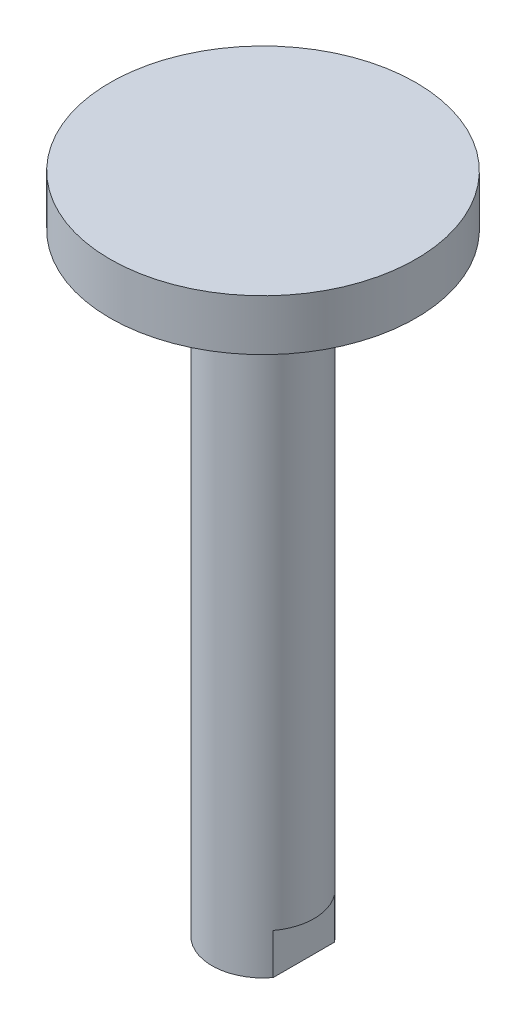
ISO-10303-21;
HEADER;
FILE_DESCRIPTION(('STEP AP214'),'2;1');
FILE_NAME('part.step','',(''),(''),'','','');
FILE_SCHEMA(('AUTOMOTIVE_DESIGN { 1 0 10303 214 1 1 1 1 }'));
ENDSEC;
DATA;
#1=APPLICATION_CONTEXT('core data for automotive mechanical design processes');
#2=APPLICATION_PROTOCOL_DEFINITION('international standard','automotive_design',2000,#1);
#3=PRODUCT_CONTEXT('',#1,'mechanical');
#4=PRODUCT('Part','Part','',(#3));
#5=PRODUCT_RELATED_PRODUCT_CATEGORY('part','',(#4));
#6=PRODUCT_DEFINITION_FORMATION('','',#4);
#7=PRODUCT_DEFINITION_CONTEXT('part definition',#1,'design');
#8=PRODUCT_DEFINITION('design','',#6,#7);
#9=PRODUCT_DEFINITION_SHAPE('','',#8);
#10=(LENGTH_UNIT() NAMED_UNIT(*) SI_UNIT(.MILLI.,.METRE.));
#11=(NAMED_UNIT(*) PLANE_ANGLE_UNIT() SI_UNIT($,.RADIAN.));
#12=(NAMED_UNIT(*) SI_UNIT($,.STERADIAN.) SOLID_ANGLE_UNIT());
#13=UNCERTAINTY_MEASURE_WITH_UNIT(LENGTH_MEASURE(1.E-05),#10,'distance_accuracy_value','');
#14=(GEOMETRIC_REPRESENTATION_CONTEXT(3) GLOBAL_UNCERTAINTY_ASSIGNED_CONTEXT((#13)) GLOBAL_UNIT_ASSIGNED_CONTEXT((#10,
#11,#12)) REPRESENTATION_CONTEXT('',''));
#15=CARTESIAN_POINT('',(0.,0.,0.));
#16=DIRECTION('',(0.,0.,1.));
#17=DIRECTION('',(1.,0.,0.));
#18=AXIS2_PLACEMENT_3D('',#15,#16,#17);
#19=CARTESIAN_POINT('',(0.,0.,0.));
#20=DIRECTION('',(0.,1.,0.));
#21=DIRECTION('',(0.,0.,1.));
#22=AXIS2_PLACEMENT_3D('',#19,#20,#21);
#23=PLANE('',#22);
#24=CARTESIAN_POINT('',(0.,0.,0.));
#25=DIRECTION('',(0.,-1.,0.));
#26=DIRECTION('',(0.,0.,-1.));
#27=AXIS2_PLACEMENT_3D('',#24,#25,#26);
#28=CIRCLE('',#27,2.09999999999999);
#29=CARTESIAN_POINT('',(0.,0.,-2.09999999999999));
#30=VERTEX_POINT('',#29);
#31=EDGE_CURVE('E103',#30,#30,#28,.T.);
#32=ORIENTED_EDGE('',*,*,#31,.F.);
#33=EDGE_LOOP('',(#32));
#34=FACE_BOUND('',#33,.T.);
#35=CARTESIAN_POINT('',(0.,0.,0.));
#36=DIRECTION('',(0.,-1.,0.));
#37=DIRECTION('',(0.,0.,-1.));
#38=AXIS2_PLACEMENT_3D('',#35,#36,#37);
#39=CIRCLE('',#38,5.);
#40=CARTESIAN_POINT('',(-4.,0.,-3.));
#41=VERTEX_POINT('',#40);
#42=CARTESIAN_POINT('',(4.,0.,-3.));
#43=VERTEX_POINT('',#42);
#44=EDGE_CURVE('E118',#41,#43,#39,.T.);
#45=ORIENTED_EDGE('',*,*,#44,.T.);
#46=DIRECTION('',(0.,0.,1.));
#47=VECTOR('',#46,1.);
#48=CARTESIAN_POINT('',(4.,0.,-15.));
#49=LINE('',#48,#47);
#50=CARTESIAN_POINT('',(4.,0.,3.));
#51=VERTEX_POINT('',#50);
#52=EDGE_CURVE('E110',#43,#51,#49,.T.);
#53=ORIENTED_EDGE('',*,*,#52,.T.);
#54=CARTESIAN_POINT('',(-4.,0.,3.));
#55=VERTEX_POINT('',#54);
#56=EDGE_CURVE('E122',#51,#55,#39,.T.);
#57=ORIENTED_EDGE('',*,*,#56,.T.);
#58=DIRECTION('',(0.,0.,1.));
#59=VECTOR('',#58,1.);
#60=CARTESIAN_POINT('',(-4.,0.,-15.));
#61=LINE('',#60,#59);
#62=EDGE_CURVE('E92',#41,#55,#61,.T.);
#63=ORIENTED_EDGE('',*,*,#62,.F.);
#64=EDGE_LOOP('',(#45,#53,#57,#63));
#65=FACE_BOUND('',#64,.T.);
#66=ADVANCED_FACE('F39',(#34,#65),#23,.F.);
#67=CARTESIAN_POINT('',(0.,0.,0.));
#68=DIRECTION('',(0.,-1.,0.));
#69=DIRECTION('',(0.,0.,-1.));
#70=AXIS2_PLACEMENT_3D('',#67,#68,#69);
#71=CYLINDRICAL_SURFACE('',#70,5.);
#72=ORIENTED_EDGE('',*,*,#56,.F.);
#73=DIRECTION('',(0.,-1.,0.));
#74=VECTOR('',#73,1.);
#75=CARTESIAN_POINT('',(4.,0.,3.));
#76=LINE('',#75,#74);
#77=CARTESIAN_POINT('',(4.,4.,3.));
#78=VERTEX_POINT('',#77);
#79=EDGE_CURVE('E11',#51,#78,#76,.F.);
#80=ORIENTED_EDGE('',*,*,#79,.T.);
#81=CARTESIAN_POINT('',(0.,4.,0.));
#82=DIRECTION('',(0.,1.,0.));
#83=DIRECTION('',(-1.,0.,0.));
#84=AXIS2_PLACEMENT_3D('',#81,#82,#83);
#85=CIRCLE('',#84,5.);
#86=CARTESIAN_POINT('',(4.,4.,-3.));
#87=VERTEX_POINT('',#86);
#88=EDGE_CURVE('E96',#78,#87,#85,.T.);
#89=ORIENTED_EDGE('',*,*,#88,.T.);
#90=DIRECTION('',(0.,-1.,0.));
#91=VECTOR('',#90,1.);
#92=CARTESIAN_POINT('',(4.,0.,-3.));
#93=LINE('',#92,#91);
#94=EDGE_CURVE('E46',#87,#43,#93,.T.);
#95=ORIENTED_EDGE('',*,*,#94,.T.);
#96=ORIENTED_EDGE('',*,*,#44,.F.);
#97=DIRECTION('',(0.,-1.,0.));
#98=VECTOR('',#97,1.);
#99=CARTESIAN_POINT('',(-4.,0.,-3.));
#100=LINE('',#99,#98);
#101=CARTESIAN_POINT('',(-4.,4.,-3.));
#102=VERTEX_POINT('',#101);
#103=EDGE_CURVE('E89',#41,#102,#100,.F.);
#104=ORIENTED_EDGE('',*,*,#103,.T.);
#105=CARTESIAN_POINT('',(0.,4.00000000000001,0.));
#106=DIRECTION('',(0.,1.,0.));
#107=DIRECTION('',(-1.,0.,0.));
#108=AXIS2_PLACEMENT_3D('',#105,#106,#107);
#109=CIRCLE('',#108,5.);
#110=CARTESIAN_POINT('',(-4.,4.,3.));
#111=VERTEX_POINT('',#110);
#112=EDGE_CURVE('E82',#102,#111,#109,.T.);
#113=ORIENTED_EDGE('',*,*,#112,.T.);
#114=DIRECTION('',(0.,-1.,0.));
#115=VECTOR('',#114,1.);
#116=CARTESIAN_POINT('',(-4.,0.,3.));
#117=LINE('',#116,#115);
#118=EDGE_CURVE('E87',#111,#55,#117,.T.);
#119=ORIENTED_EDGE('',*,*,#118,.T.);
#120=EDGE_LOOP('',(#72,#80,#89,#95,#96,#104,#113,#119));
#121=FACE_BOUND('',#120,.T.);
#122=CARTESIAN_POINT('',(0.,60.,0.));
#123=DIRECTION('',(0.,-1.,0.));
#124=DIRECTION('',(0.,0.,-1.));
#125=AXIS2_PLACEMENT_3D('',#122,#123,#124);
#126=CIRCLE('',#125,5.);
#127=CARTESIAN_POINT('',(0.,60.,-5.));
#128=VERTEX_POINT('',#127);
#129=EDGE_CURVE('E116',#128,#128,#126,.T.);
#130=ORIENTED_EDGE('',*,*,#129,.T.);
#131=EDGE_LOOP('',(#130));
#132=FACE_BOUND('',#131,.T.);
#133=ADVANCED_FACE('F84',(#121,#132),#71,.T.);
#134=CARTESIAN_POINT('',(-5.,60.,0.));
#135=DIRECTION('',(0.,1.,0.));
#136=DIRECTION('',(0.,0.,1.));
#137=AXIS2_PLACEMENT_3D('',#134,#135,#136);
#138=PLANE('',#137);
#139=ORIENTED_EDGE('',*,*,#129,.F.);
#140=EDGE_LOOP('',(#139));
#141=FACE_BOUND('',#140,.T.);
#142=CARTESIAN_POINT('',(0.,60.,0.));
#143=DIRECTION('',(0.,-1.,0.));
#144=DIRECTION('',(0.,0.,-1.));
#145=AXIS2_PLACEMENT_3D('',#142,#143,#144);
#146=CIRCLE('',#145,15.);
#147=CARTESIAN_POINT('',(0.,60.,-15.));
#148=VERTEX_POINT('',#147);
#149=EDGE_CURVE('E114',#148,#148,#146,.T.);
#150=ORIENTED_EDGE('',*,*,#149,.T.);
#151=EDGE_LOOP('',(#150));
#152=FACE_BOUND('',#151,.T.);
#153=ADVANCED_FACE('F148',(#141,#152),#138,.F.);
#154=CARTESIAN_POINT('',(0.,0.,0.));
#155=DIRECTION('',(0.,-1.,0.));
#156=DIRECTION('',(0.,0.,-1.));
#157=AXIS2_PLACEMENT_3D('',#154,#155,#156);
#158=CYLINDRICAL_SURFACE('',#157,15.);
#159=ORIENTED_EDGE('',*,*,#149,.F.);
#160=EDGE_LOOP('',(#159));
#161=FACE_BOUND('',#160,.T.);
#162=CARTESIAN_POINT('',(0.,65.,0.));
#163=DIRECTION('',(0.,-1.,0.));
#164=DIRECTION('',(0.,0.,-1.));
#165=AXIS2_PLACEMENT_3D('',#162,#163,#164);
#166=CIRCLE('',#165,15.);
#167=CARTESIAN_POINT('',(0.,65.,-15.));
#168=VERTEX_POINT('',#167);
#169=EDGE_CURVE('E109',#168,#168,#166,.T.);
#170=ORIENTED_EDGE('',*,*,#169,.T.);
#171=EDGE_LOOP('',(#170));
#172=FACE_BOUND('',#171,.T.);
#173=ADVANCED_FACE('F164',(#161,#172),#158,.T.);
#174=CARTESIAN_POINT('',(-15.,65.,0.));
#175=DIRECTION('',(0.,-1.,0.));
#176=DIRECTION('',(0.,0.,-1.));
#177=AXIS2_PLACEMENT_3D('',#174,#175,#176);
#178=PLANE('',#177);
#179=ORIENTED_EDGE('',*,*,#169,.F.);
#180=EDGE_LOOP('',(#179));
#181=FACE_BOUND('',#180,.T.);
#182=ADVANCED_FACE('F158',(#181),#178,.F.);
#183=CARTESIAN_POINT('',(0.,10.,0.));
#184=DIRECTION('',(0.,-1.,0.));
#185=DIRECTION('',(0.,0.,-1.));
#186=AXIS2_PLACEMENT_3D('',#183,#184,#185);
#187=CONICAL_SURFACE('',#186,2.1,1.02974425867665);
#188=CARTESIAN_POINT('',(0.,11.2618072999579,0.));
#189=VERTEX_POINT('',#188);
#190=VERTEX_LOOP('',#189);
#191=FACE_BOUND('',#190,.T.);
#192=CARTESIAN_POINT('',(0.,10.,0.));
#193=DIRECTION('',(0.,-1.,0.));
#194=DIRECTION('',(0.,0.,-1.));
#195=AXIS2_PLACEMENT_3D('',#192,#193,#194);
#196=CIRCLE('',#195,2.1);
#197=CARTESIAN_POINT('',(0.,10.,-2.1));
#198=VERTEX_POINT('',#197);
#199=EDGE_CURVE('E106',#198,#198,#196,.T.);
#200=ORIENTED_EDGE('',*,*,#199,.T.);
#201=EDGE_LOOP('',(#200));
#202=FACE_BOUND('',#201,.T.);
#203=ADVANCED_FACE('F147',(#191,#202),#187,.F.);
#204=CARTESIAN_POINT('',(0.,0.,0.));
#205=DIRECTION('',(0.,-1.,0.));
#206=DIRECTION('',(0.,0.,-1.));
#207=AXIS2_PLACEMENT_3D('',#204,#205,#206);
#208=CYLINDRICAL_SURFACE('',#207,2.09999999999999);
#209=ORIENTED_EDGE('',*,*,#199,.F.);
#210=EDGE_LOOP('',(#209));
#211=FACE_BOUND('',#210,.T.);
#212=ORIENTED_EDGE('',*,*,#31,.T.);
#213=EDGE_LOOP('',(#212));
#214=FACE_BOUND('',#213,.T.);
#215=ADVANCED_FACE('F149',(#211,#214),#208,.F.);
#216=CARTESIAN_POINT('',(-4.,4.,-15.));
#217=DIRECTION('',(0.,1.,0.));
#218=DIRECTION('',(-1.,0.,0.));
#219=AXIS2_PLACEMENT_3D('',#216,#217,#218);
#220=PLANE('',#219);
#221=ORIENTED_EDGE('',*,*,#112,.F.);
#222=DIRECTION('',(0.,0.,1.));
#223=VECTOR('',#222,1.);
#224=CARTESIAN_POINT('',(-4.,4.,-15.));
#225=LINE('',#224,#223);
#226=EDGE_CURVE('E58',#102,#111,#225,.T.);
#227=ORIENTED_EDGE('',*,*,#226,.T.);
#228=EDGE_LOOP('',(#221,#227));
#229=FACE_BOUND('',#228,.T.);
#230=ADVANCED_FACE('F98',(#229),#220,.F.);
#231=CARTESIAN_POINT('',(-4.,0.,-15.));
#232=DIRECTION('',(1.,0.,0.));
#233=DIRECTION('',(0.,0.,-1.));
#234=AXIS2_PLACEMENT_3D('',#231,#232,#233);
#235=PLANE('',#234);
#236=ORIENTED_EDGE('',*,*,#226,.F.);
#237=ORIENTED_EDGE('',*,*,#103,.F.);
#238=ORIENTED_EDGE('',*,*,#62,.T.);
#239=ORIENTED_EDGE('',*,*,#118,.F.);
#240=EDGE_LOOP('',(#236,#237,#238,#239));
#241=FACE_BOUND('',#240,.T.);
#242=ADVANCED_FACE('F91',(#241),#235,.F.);
#243=CARTESIAN_POINT('',(4.,0.,-15.));
#244=DIRECTION('',(-1.,0.,0.));
#245=DIRECTION('',(0.,0.,1.));
#246=AXIS2_PLACEMENT_3D('',#243,#244,#245);
#247=PLANE('',#246);
#248=DIRECTION('',(0.,0.,1.));
#249=VECTOR('',#248,1.);
#250=CARTESIAN_POINT('',(4.,4.,-15.));
#251=LINE('',#250,#249);
#252=EDGE_CURVE('E55',#87,#78,#251,.T.);
#253=ORIENTED_EDGE('',*,*,#252,.T.);
#254=ORIENTED_EDGE('',*,*,#79,.F.);
#255=ORIENTED_EDGE('',*,*,#52,.F.);
#256=ORIENTED_EDGE('',*,*,#94,.F.);
#257=EDGE_LOOP('',(#253,#254,#255,#256));
#258=FACE_BOUND('',#257,.T.);
#259=ADVANCED_FACE('F129',(#258),#247,.F.);
#260=CARTESIAN_POINT('',(4.,4.,-15.));
#261=DIRECTION('',(0.,1.,0.));
#262=DIRECTION('',(-1.,0.,0.));
#263=AXIS2_PLACEMENT_3D('',#260,#261,#262);
#264=PLANE('',#263);
#265=ORIENTED_EDGE('',*,*,#252,.F.);
#266=ORIENTED_EDGE('',*,*,#88,.F.);
#267=EDGE_LOOP('',(#265,#266));
#268=FACE_BOUND('',#267,.T.);
#269=ADVANCED_FACE('F132',(#268),#264,.F.);
#270=CLOSED_SHELL('',(#66,#133,#153,#173,#182,#203,#215,#230,#242,#259,#269));
#271=MANIFOLD_SOLID_BREP('B2',#270);
#272=ADVANCED_BREP_SHAPE_REPRESENTATION('',(#18,#271),#14);
#273=SHAPE_DEFINITION_REPRESENTATION(#9,#272);
ENDSEC;
END-ISO-10303-21;
